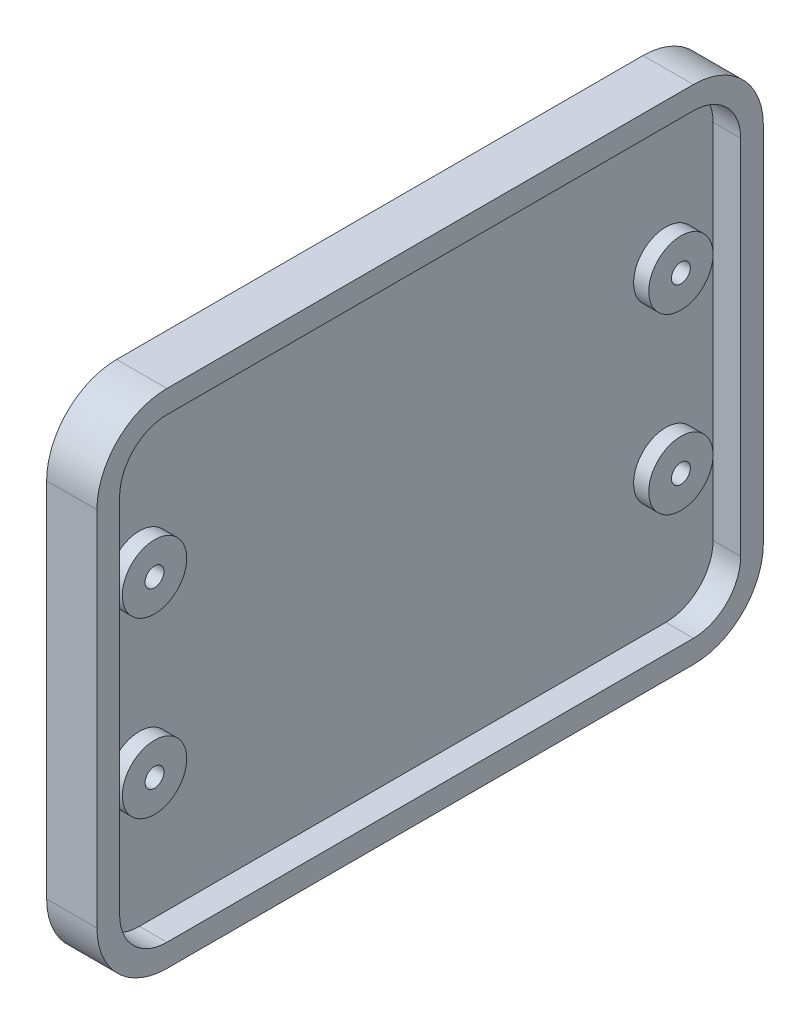
ISO-10303-21;
HEADER;
FILE_DESCRIPTION(('STEP AP214'),'2;1');
FILE_NAME('part.step','',(''),(''),'','','');
FILE_SCHEMA(('AUTOMOTIVE_DESIGN { 1 0 10303 214 1 1 1 1 }'));
ENDSEC;
DATA;
#1=APPLICATION_CONTEXT('core data for automotive mechanical design processes');
#2=APPLICATION_PROTOCOL_DEFINITION('international standard','automotive_design',2000,#1);
#3=PRODUCT_CONTEXT('',#1,'mechanical');
#4=PRODUCT('Part','Part','',(#3));
#5=PRODUCT_RELATED_PRODUCT_CATEGORY('part','',(#4));
#6=PRODUCT_DEFINITION_FORMATION('','',#4);
#7=PRODUCT_DEFINITION_CONTEXT('part definition',#1,'design');
#8=PRODUCT_DEFINITION('design','',#6,#7);
#9=PRODUCT_DEFINITION_SHAPE('','',#8);
#10=(LENGTH_UNIT() NAMED_UNIT(*) SI_UNIT(.MILLI.,.METRE.));
#11=(NAMED_UNIT(*) PLANE_ANGLE_UNIT() SI_UNIT($,.RADIAN.));
#12=(NAMED_UNIT(*) SI_UNIT($,.STERADIAN.) SOLID_ANGLE_UNIT());
#13=UNCERTAINTY_MEASURE_WITH_UNIT(LENGTH_MEASURE(1.E-05),#10,'distance_accuracy_value','');
#14=(GEOMETRIC_REPRESENTATION_CONTEXT(3) GLOBAL_UNCERTAINTY_ASSIGNED_CONTEXT((#13)) GLOBAL_UNIT_ASSIGNED_CONTEXT((#10,
#11,#12)) REPRESENTATION_CONTEXT('',''));
#15=CARTESIAN_POINT('',(0.,0.,0.));
#16=DIRECTION('',(0.,0.,1.));
#17=DIRECTION('',(1.,0.,0.));
#18=AXIS2_PLACEMENT_3D('',#15,#16,#17);
#19=CARTESIAN_POINT('',(0.,-6.,6.));
#20=DIRECTION('',(-1.,0.,0.));
#21=DIRECTION('',(0.,0.,1.));
#22=AXIS2_PLACEMENT_3D('',#19,#20,#21);
#23=PLANE('',#22);
#24=CARTESIAN_POINT('',(0.,-19.12,75.53));
#25=DIRECTION('',(-1.,0.,0.));
#26=DIRECTION('',(0.,0.,1.));
#27=AXIS2_PLACEMENT_3D('',#24,#25,#26);
#28=CIRCLE('',#27,4.25);
#29=CARTESIAN_POINT('',(0.,-19.12,79.78));
#30=VERTEX_POINT('',#29);
#31=EDGE_CURVE('E365',#30,#30,#28,.F.);
#32=ORIENTED_EDGE('',*,*,#31,.F.);
#33=EDGE_LOOP('',(#32));
#34=FACE_BOUND('',#33,.T.);
#35=CARTESIAN_POINT('',(0.,-19.12,6.));
#36=DIRECTION('',(-1.,0.,0.));
#37=DIRECTION('',(0.,0.,1.));
#38=AXIS2_PLACEMENT_3D('',#35,#36,#37);
#39=CIRCLE('',#38,4.25);
#40=CARTESIAN_POINT('',(0.,-19.12,10.25));
#41=VERTEX_POINT('',#40);
#42=EDGE_CURVE('E369',#41,#41,#39,.F.);
#43=ORIENTED_EDGE('',*,*,#42,.F.);
#44=EDGE_LOOP('',(#43));
#45=FACE_BOUND('',#44,.T.);
#46=CARTESIAN_POINT('',(0.,-42.05,6.));
#47=DIRECTION('',(-1.,0.,0.));
#48=DIRECTION('',(0.,0.,1.));
#49=AXIS2_PLACEMENT_3D('',#46,#47,#48);
#50=CIRCLE('',#49,4.25);
#51=CARTESIAN_POINT('',(0.,-42.05,10.25));
#52=VERTEX_POINT('',#51);
#53=EDGE_CURVE('E48',#52,#52,#50,.F.);
#54=ORIENTED_EDGE('',*,*,#53,.F.);
#55=EDGE_LOOP('',(#54));
#56=FACE_BOUND('',#55,.T.);
#57=CARTESIAN_POINT('',(0.,-42.05,75.53));
#58=DIRECTION('',(-1.,0.,0.));
#59=DIRECTION('',(0.,0.,1.));
#60=AXIS2_PLACEMENT_3D('',#57,#58,#59);
#61=CIRCLE('',#60,4.25);
#62=CARTESIAN_POINT('',(0.,-42.05,79.78));
#63=VERTEX_POINT('',#62);
#64=EDGE_CURVE('E11',#63,#63,#61,.F.);
#65=ORIENTED_EDGE('',*,*,#64,.F.);
#66=EDGE_LOOP('',(#65));
#67=FACE_BOUND('',#66,.T.);
#68=CARTESIAN_POINT('',(0.,-6.,6.));
#69=DIRECTION('',(1.,0.,0.));
#70=DIRECTION('',(0.,0.,-1.));
#71=AXIS2_PLACEMENT_3D('',#68,#69,#70);
#72=CIRCLE('',#71,6.25);
#73=CARTESIAN_POINT('',(0.,0.249999999999999,6.00000000000004));
#74=VERTEX_POINT('',#73);
#75=CARTESIAN_POINT('',(0.,-6.00000000000004,-0.25));
#76=VERTEX_POINT('',#75);
#77=EDGE_CURVE('E244',#74,#76,#72,.F.);
#78=ORIENTED_EDGE('',*,*,#77,.F.);
#79=DIRECTION('',(0.,0.,1.));
#80=VECTOR('',#79,1.);
#81=CARTESIAN_POINT('',(0.,0.249999999999999,0.));
#82=LINE('',#81,#80);
#83=CARTESIAN_POINT('',(0.,0.249999999999999,75.53));
#84=VERTEX_POINT('',#83);
#85=EDGE_CURVE('E240',#74,#84,#82,.T.);
#86=ORIENTED_EDGE('',*,*,#85,.T.);
#87=CARTESIAN_POINT('',(0.,-6.00000000000001,75.53));
#88=DIRECTION('',(1.,0.,0.));
#89=DIRECTION('',(0.,0.,-1.));
#90=AXIS2_PLACEMENT_3D('',#87,#88,#89);
#91=CIRCLE('',#90,6.25000000000001);
#92=CARTESIAN_POINT('',(0.,-6.00000000000001,81.78));
#93=VERTEX_POINT('',#92);
#94=EDGE_CURVE('E179',#84,#93,#91,.T.);
#95=ORIENTED_EDGE('',*,*,#94,.T.);
#96=DIRECTION('',(0.,-1.,0.));
#97=VECTOR('',#96,1.);
#98=CARTESIAN_POINT('',(0.,0.,81.78));
#99=LINE('',#98,#97);
#100=CARTESIAN_POINT('',(0.,-53.85,81.78));
#101=VERTEX_POINT('',#100);
#102=EDGE_CURVE('E55',#93,#101,#99,.T.);
#103=ORIENTED_EDGE('',*,*,#102,.T.);
#104=CARTESIAN_POINT('',(0.,-53.85,75.53));
#105=DIRECTION('',(1.,0.,0.));
#106=DIRECTION('',(0.,0.,-1.));
#107=AXIS2_PLACEMENT_3D('',#104,#105,#106);
#108=CIRCLE('',#107,6.25000000000001);
#109=CARTESIAN_POINT('',(0.,-60.1,75.5299999999999));
#110=VERTEX_POINT('',#109);
#111=EDGE_CURVE('E260',#110,#101,#108,.F.);
#112=ORIENTED_EDGE('',*,*,#111,.F.);
#113=DIRECTION('',(0.,0.,1.));
#114=VECTOR('',#113,1.);
#115=CARTESIAN_POINT('',(0.,-60.1,0.));
#116=LINE('',#115,#114);
#117=CARTESIAN_POINT('',(0.,-60.1,6.00000000000004));
#118=VERTEX_POINT('',#117);
#119=EDGE_CURVE('E256',#118,#110,#116,.T.);
#120=ORIENTED_EDGE('',*,*,#119,.F.);
#121=CARTESIAN_POINT('',(0.,-53.85,6.));
#122=DIRECTION('',(1.,0.,0.));
#123=DIRECTION('',(0.,0.,-1.));
#124=AXIS2_PLACEMENT_3D('',#121,#122,#123);
#125=CIRCLE('',#124,6.25);
#126=CARTESIAN_POINT('',(0.,-53.85,-0.249999999999999));
#127=VERTEX_POINT('',#126);
#128=EDGE_CURVE('E252',#127,#118,#125,.F.);
#129=ORIENTED_EDGE('',*,*,#128,.F.);
#130=DIRECTION('',(0.,-1.,0.));
#131=VECTOR('',#130,1.);
#132=CARTESIAN_POINT('',(0.,0.,-0.25));
#133=LINE('',#132,#131);
#134=EDGE_CURVE('E248',#76,#127,#133,.T.);
#135=ORIENTED_EDGE('',*,*,#134,.F.);
#136=EDGE_LOOP('',(#78,#86,#95,#103,#112,#120,#129,#135));
#137=FACE_BOUND('',#136,.T.);
#138=ADVANCED_FACE('F39',(#34,#45,#56,#67,#137),#23,.F.);
#139=CARTESIAN_POINT('',(2.,-19.12,75.53));
#140=DIRECTION('',(-1.,0.,0.));
#141=DIRECTION('',(0.,0.,1.));
#142=AXIS2_PLACEMENT_3D('',#139,#140,#141);
#143=CYLINDRICAL_SURFACE('',#142,1.25);
#144=CARTESIAN_POINT('',(2.,-19.12,75.53));
#145=DIRECTION('',(1.,0.,0.));
#146=DIRECTION('',(0.,0.,-1.));
#147=AXIS2_PLACEMENT_3D('',#144,#145,#146);
#148=CIRCLE('',#147,1.25);
#149=CARTESIAN_POINT('',(2.,-19.12,74.28));
#150=VERTEX_POINT('',#149);
#151=EDGE_CURVE('E313',#150,#150,#148,.T.);
#152=ORIENTED_EDGE('',*,*,#151,.T.);
#153=EDGE_LOOP('',(#152));
#154=FACE_BOUND('',#153,.T.);
#155=CARTESIAN_POINT('',(-3.,-19.12,75.53));
#156=DIRECTION('',(-1.,0.,0.));
#157=DIRECTION('',(0.,0.,1.));
#158=AXIS2_PLACEMENT_3D('',#155,#156,#157);
#159=CIRCLE('',#158,1.25);
#160=CARTESIAN_POINT('',(-3.,-19.12,76.78));
#161=VERTEX_POINT('',#160);
#162=EDGE_CURVE('E185',#161,#161,#159,.F.);
#163=ORIENTED_EDGE('',*,*,#162,.F.);
#164=EDGE_LOOP('',(#163));
#165=FACE_BOUND('',#164,.T.);
#166=ADVANCED_FACE('F380',(#154,#165),#143,.F.);
#167=CARTESIAN_POINT('',(2.,-19.12,75.53));
#168=DIRECTION('',(-1.,0.,0.));
#169=DIRECTION('',(0.,0.,1.));
#170=AXIS2_PLACEMENT_3D('',#167,#168,#169);
#171=CYLINDRICAL_SURFACE('',#170,4.25);
#172=CARTESIAN_POINT('',(2.,-19.12,75.53));
#173=DIRECTION('',(1.,0.,0.));
#174=DIRECTION('',(0.,0.,-1.));
#175=AXIS2_PLACEMENT_3D('',#172,#173,#174);
#176=CIRCLE('',#175,4.25);
#177=CARTESIAN_POINT('',(2.,-19.12,71.28));
#178=VERTEX_POINT('',#177);
#179=EDGE_CURVE('E317',#178,#178,#176,.T.);
#180=ORIENTED_EDGE('',*,*,#179,.F.);
#181=EDGE_LOOP('',(#180));
#182=FACE_BOUND('',#181,.T.);
#183=ORIENTED_EDGE('',*,*,#31,.T.);
#184=EDGE_LOOP('',(#183));
#185=FACE_BOUND('',#184,.T.);
#186=ADVANCED_FACE('F474',(#182,#185),#171,.T.);
#187=CARTESIAN_POINT('',(2.,0.,0.));
#188=DIRECTION('',(1.,0.,0.));
#189=DIRECTION('',(0.,0.,-1.));
#190=AXIS2_PLACEMENT_3D('',#187,#188,#189);
#191=PLANE('',#190);
#192=ORIENTED_EDGE('',*,*,#151,.F.);
#193=EDGE_LOOP('',(#192));
#194=FACE_BOUND('',#193,.T.);
#195=ORIENTED_EDGE('',*,*,#179,.T.);
#196=EDGE_LOOP('',(#195));
#197=FACE_BOUND('',#196,.T.);
#198=ADVANCED_FACE('F470',(#194,#197),#191,.T.);
#199=CARTESIAN_POINT('',(2.,-19.12,6.));
#200=DIRECTION('',(-1.,0.,0.));
#201=DIRECTION('',(0.,0.,1.));
#202=AXIS2_PLACEMENT_3D('',#199,#200,#201);
#203=CYLINDRICAL_SURFACE('',#202,1.25);
#204=CARTESIAN_POINT('',(2.,-19.12,6.));
#205=DIRECTION('',(1.,0.,0.));
#206=DIRECTION('',(0.,0.,-1.));
#207=AXIS2_PLACEMENT_3D('',#204,#205,#206);
#208=CIRCLE('',#207,1.25);
#209=CARTESIAN_POINT('',(2.,-19.12,4.75));
#210=VERTEX_POINT('',#209);
#211=EDGE_CURVE('E305',#210,#210,#208,.T.);
#212=ORIENTED_EDGE('',*,*,#211,.T.);
#213=EDGE_LOOP('',(#212));
#214=FACE_BOUND('',#213,.T.);
#215=CARTESIAN_POINT('',(-3.,-19.12,6.));
#216=DIRECTION('',(-1.,0.,0.));
#217=DIRECTION('',(0.,0.,1.));
#218=AXIS2_PLACEMENT_3D('',#215,#216,#217);
#219=CIRCLE('',#218,1.25);
#220=CARTESIAN_POINT('',(-3.,-19.12,7.25));
#221=VERTEX_POINT('',#220);
#222=EDGE_CURVE('E756',#221,#221,#219,.F.);
#223=ORIENTED_EDGE('',*,*,#222,.F.);
#224=EDGE_LOOP('',(#223));
#225=FACE_BOUND('',#224,.T.);
#226=ADVANCED_FACE('F466',(#214,#225),#203,.F.);
#227=CARTESIAN_POINT('',(2.,-19.12,6.));
#228=DIRECTION('',(-1.,0.,0.));
#229=DIRECTION('',(0.,0.,1.));
#230=AXIS2_PLACEMENT_3D('',#227,#228,#229);
#231=CYLINDRICAL_SURFACE('',#230,4.25);
#232=CARTESIAN_POINT('',(2.,-19.12,6.));
#233=DIRECTION('',(1.,0.,0.));
#234=DIRECTION('',(0.,0.,-1.));
#235=AXIS2_PLACEMENT_3D('',#232,#233,#234);
#236=CIRCLE('',#235,4.25);
#237=CARTESIAN_POINT('',(2.,-19.12,1.75));
#238=VERTEX_POINT('',#237);
#239=EDGE_CURVE('E309',#238,#238,#236,.T.);
#240=ORIENTED_EDGE('',*,*,#239,.F.);
#241=EDGE_LOOP('',(#240));
#242=FACE_BOUND('',#241,.T.);
#243=ORIENTED_EDGE('',*,*,#42,.T.);
#244=EDGE_LOOP('',(#243));
#245=FACE_BOUND('',#244,.T.);
#246=ADVANCED_FACE('F462',(#242,#245),#231,.T.);
#247=CARTESIAN_POINT('',(2.,0.,0.));
#248=DIRECTION('',(1.,0.,0.));
#249=DIRECTION('',(0.,0.,-1.));
#250=AXIS2_PLACEMENT_3D('',#247,#248,#249);
#251=PLANE('',#250);
#252=ORIENTED_EDGE('',*,*,#211,.F.);
#253=EDGE_LOOP('',(#252));
#254=FACE_BOUND('',#253,.T.);
#255=ORIENTED_EDGE('',*,*,#239,.T.);
#256=EDGE_LOOP('',(#255));
#257=FACE_BOUND('',#256,.T.);
#258=ADVANCED_FACE('F458',(#254,#257),#251,.T.);
#259=CARTESIAN_POINT('',(2.,-42.05,6.));
#260=DIRECTION('',(-1.,0.,0.));
#261=DIRECTION('',(0.,0.,1.));
#262=AXIS2_PLACEMENT_3D('',#259,#260,#261);
#263=CYLINDRICAL_SURFACE('',#262,1.25);
#264=CARTESIAN_POINT('',(2.,-42.05,6.));
#265=DIRECTION('',(1.,0.,0.));
#266=DIRECTION('',(0.,0.,-1.));
#267=AXIS2_PLACEMENT_3D('',#264,#265,#266);
#268=CIRCLE('',#267,1.25);
#269=CARTESIAN_POINT('',(2.,-42.05,4.75));
#270=VERTEX_POINT('',#269);
#271=EDGE_CURVE('E297',#270,#270,#268,.T.);
#272=ORIENTED_EDGE('',*,*,#271,.T.);
#273=EDGE_LOOP('',(#272));
#274=FACE_BOUND('',#273,.T.);
#275=CARTESIAN_POINT('',(-3.,-42.05,6.));
#276=DIRECTION('',(-1.,0.,0.));
#277=DIRECTION('',(0.,0.,1.));
#278=AXIS2_PLACEMENT_3D('',#275,#276,#277);
#279=CIRCLE('',#278,1.25);
#280=CARTESIAN_POINT('',(-3.,-42.05,7.25));
#281=VERTEX_POINT('',#280);
#282=EDGE_CURVE('E752',#281,#281,#279,.F.);
#283=ORIENTED_EDGE('',*,*,#282,.F.);
#284=EDGE_LOOP('',(#283));
#285=FACE_BOUND('',#284,.T.);
#286=ADVANCED_FACE('F454',(#274,#285),#263,.F.);
#287=CARTESIAN_POINT('',(2.,-42.05,6.));
#288=DIRECTION('',(-1.,0.,0.));
#289=DIRECTION('',(0.,0.,1.));
#290=AXIS2_PLACEMENT_3D('',#287,#288,#289);
#291=CYLINDRICAL_SURFACE('',#290,4.25);
#292=CARTESIAN_POINT('',(2.,-42.05,6.));
#293=DIRECTION('',(1.,0.,0.));
#294=DIRECTION('',(0.,0.,-1.));
#295=AXIS2_PLACEMENT_3D('',#292,#293,#294);
#296=CIRCLE('',#295,4.25);
#297=CARTESIAN_POINT('',(2.,-42.05,1.75));
#298=VERTEX_POINT('',#297);
#299=EDGE_CURVE('E301',#298,#298,#296,.T.);
#300=ORIENTED_EDGE('',*,*,#299,.F.);
#301=EDGE_LOOP('',(#300));
#302=FACE_BOUND('',#301,.T.);
#303=ORIENTED_EDGE('',*,*,#53,.T.);
#304=EDGE_LOOP('',(#303));
#305=FACE_BOUND('',#304,.T.);
#306=ADVANCED_FACE('F376',(#302,#305),#291,.T.);
#307=CARTESIAN_POINT('',(2.,0.,0.));
#308=DIRECTION('',(1.,0.,0.));
#309=DIRECTION('',(0.,0.,-1.));
#310=AXIS2_PLACEMENT_3D('',#307,#308,#309);
#311=PLANE('',#310);
#312=ORIENTED_EDGE('',*,*,#271,.F.);
#313=EDGE_LOOP('',(#312));
#314=FACE_BOUND('',#313,.T.);
#315=ORIENTED_EDGE('',*,*,#299,.T.);
#316=EDGE_LOOP('',(#315));
#317=FACE_BOUND('',#316,.T.);
#318=ADVANCED_FACE('F447',(#314,#317),#311,.T.);
#319=CARTESIAN_POINT('',(2.,-42.05,75.53));
#320=DIRECTION('',(-1.,0.,0.));
#321=DIRECTION('',(0.,0.,1.));
#322=AXIS2_PLACEMENT_3D('',#319,#320,#321);
#323=CYLINDRICAL_SURFACE('',#322,1.25);
#324=CARTESIAN_POINT('',(2.,-42.05,75.53));
#325=DIRECTION('',(1.,0.,0.));
#326=DIRECTION('',(0.,0.,-1.));
#327=AXIS2_PLACEMENT_3D('',#324,#325,#326);
#328=CIRCLE('',#327,1.25);
#329=CARTESIAN_POINT('',(2.,-42.05,74.28));
#330=VERTEX_POINT('',#329);
#331=EDGE_CURVE('E289',#330,#330,#328,.T.);
#332=ORIENTED_EDGE('',*,*,#331,.T.);
#333=EDGE_LOOP('',(#332));
#334=FACE_BOUND('',#333,.T.);
#335=CARTESIAN_POINT('',(-3.,-42.05,75.53));
#336=DIRECTION('',(-1.,0.,0.));
#337=DIRECTION('',(0.,0.,1.));
#338=AXIS2_PLACEMENT_3D('',#335,#336,#337);
#339=CIRCLE('',#338,1.25);
#340=CARTESIAN_POINT('',(-3.,-42.05,76.78));
#341=VERTEX_POINT('',#340);
#342=EDGE_CURVE('E748',#341,#341,#339,.F.);
#343=ORIENTED_EDGE('',*,*,#342,.F.);
#344=EDGE_LOOP('',(#343));
#345=FACE_BOUND('',#344,.T.);
#346=ADVANCED_FACE('F443',(#334,#345),#323,.F.);
#347=CARTESIAN_POINT('',(2.,-42.05,75.53));
#348=DIRECTION('',(-1.,0.,0.));
#349=DIRECTION('',(0.,0.,1.));
#350=AXIS2_PLACEMENT_3D('',#347,#348,#349);
#351=CYLINDRICAL_SURFACE('',#350,4.25);
#352=CARTESIAN_POINT('',(2.,-42.05,75.53));
#353=DIRECTION('',(1.,0.,0.));
#354=DIRECTION('',(0.,0.,-1.));
#355=AXIS2_PLACEMENT_3D('',#352,#353,#354);
#356=CIRCLE('',#355,4.25);
#357=CARTESIAN_POINT('',(2.,-42.05,71.28));
#358=VERTEX_POINT('',#357);
#359=EDGE_CURVE('E293',#358,#358,#356,.T.);
#360=ORIENTED_EDGE('',*,*,#359,.F.);
#361=EDGE_LOOP('',(#360));
#362=FACE_BOUND('',#361,.T.);
#363=ORIENTED_EDGE('',*,*,#64,.T.);
#364=EDGE_LOOP('',(#363));
#365=FACE_BOUND('',#364,.T.);
#366=ADVANCED_FACE('F439',(#362,#365),#351,.T.);
#367=CARTESIAN_POINT('',(2.,0.,0.));
#368=DIRECTION('',(1.,0.,0.));
#369=DIRECTION('',(0.,0.,-1.));
#370=AXIS2_PLACEMENT_3D('',#367,#368,#369);
#371=PLANE('',#370);
#372=ORIENTED_EDGE('',*,*,#331,.F.);
#373=EDGE_LOOP('',(#372));
#374=FACE_BOUND('',#373,.T.);
#375=ORIENTED_EDGE('',*,*,#359,.T.);
#376=EDGE_LOOP('',(#375));
#377=FACE_BOUND('',#376,.T.);
#378=ADVANCED_FACE('F436',(#374,#377),#371,.T.);
#379=CARTESIAN_POINT('',(3.64,0.249999999999999,0.));
#380=DIRECTION('',(0.,-1.,0.));
#381=DIRECTION('',(0.,0.,-1.));
#382=AXIS2_PLACEMENT_3D('',#379,#380,#381);
#383=PLANE('',#382);
#384=ORIENTED_EDGE('',*,*,#85,.F.);
#385=DIRECTION('',(-1.,0.,0.));
#386=VECTOR('',#385,1.);
#387=CARTESIAN_POINT('',(3.64,0.249999999999999,6.00000000000004));
#388=LINE('',#387,#386);
#389=CARTESIAN_POINT('',(3.64,0.249999999999999,6.00000000000004));
#390=VERTEX_POINT('',#389);
#391=EDGE_CURVE('E286',#390,#74,#388,.T.);
#392=ORIENTED_EDGE('',*,*,#391,.F.);
#393=DIRECTION('',(0.,0.,1.));
#394=VECTOR('',#393,1.);
#395=CARTESIAN_POINT('',(3.64,0.249999999999999,0.));
#396=LINE('',#395,#394);
#397=CARTESIAN_POINT('',(3.64,0.249999999999999,75.53));
#398=VERTEX_POINT('',#397);
#399=EDGE_CURVE('E208',#390,#398,#396,.T.);
#400=ORIENTED_EDGE('',*,*,#399,.T.);
#401=DIRECTION('',(-1.,0.,0.));
#402=VECTOR('',#401,1.);
#403=CARTESIAN_POINT('',(3.64,0.249999999999999,75.53));
#404=LINE('',#403,#402);
#405=EDGE_CURVE('E239',#398,#84,#404,.T.);
#406=ORIENTED_EDGE('',*,*,#405,.T.);
#407=EDGE_LOOP('',(#384,#392,#400,#406));
#408=FACE_BOUND('',#407,.T.);
#409=ADVANCED_FACE('F395',(#408),#383,.T.);
#410=CARTESIAN_POINT('',(3.64,-6.,6.));
#411=DIRECTION('',(-1.,0.,0.));
#412=DIRECTION('',(0.,0.,1.));
#413=AXIS2_PLACEMENT_3D('',#410,#411,#412);
#414=CYLINDRICAL_SURFACE('',#413,6.25);
#415=ORIENTED_EDGE('',*,*,#77,.T.);
#416=DIRECTION('',(-1.,0.,0.));
#417=VECTOR('',#416,1.);
#418=CARTESIAN_POINT('',(3.64,-6.00000000000004,-0.25));
#419=LINE('',#418,#417);
#420=CARTESIAN_POINT('',(3.64,-6.00000000000004,-0.25));
#421=VERTEX_POINT('',#420);
#422=EDGE_CURVE('E283',#421,#76,#419,.T.);
#423=ORIENTED_EDGE('',*,*,#422,.F.);
#424=CARTESIAN_POINT('',(3.64,-6.,6.));
#425=DIRECTION('',(1.,0.,0.));
#426=DIRECTION('',(0.,0.,-1.));
#427=AXIS2_PLACEMENT_3D('',#424,#425,#426);
#428=CIRCLE('',#427,6.25);
#429=EDGE_CURVE('E212',#390,#421,#428,.F.);
#430=ORIENTED_EDGE('',*,*,#429,.F.);
#431=ORIENTED_EDGE('',*,*,#391,.T.);
#432=EDGE_LOOP('',(#415,#423,#430,#431));
#433=FACE_BOUND('',#432,.T.);
#434=ADVANCED_FACE('F391',(#433),#414,.F.);
#435=CARTESIAN_POINT('',(3.64,0.,-0.25));
#436=DIRECTION('',(0.,0.,-1.));
#437=DIRECTION('',(0.,1.,0.));
#438=AXIS2_PLACEMENT_3D('',#435,#436,#437);
#439=PLANE('',#438);
#440=ORIENTED_EDGE('',*,*,#134,.T.);
#441=DIRECTION('',(-1.,0.,0.));
#442=VECTOR('',#441,1.);
#443=CARTESIAN_POINT('',(3.64,-53.85,-0.249999999999999));
#444=LINE('',#443,#442);
#445=CARTESIAN_POINT('',(3.64,-53.85,-0.249999999999999));
#446=VERTEX_POINT('',#445);
#447=EDGE_CURVE('E280',#446,#127,#444,.T.);
#448=ORIENTED_EDGE('',*,*,#447,.F.);
#449=DIRECTION('',(0.,-1.,0.));
#450=VECTOR('',#449,1.);
#451=CARTESIAN_POINT('',(3.64,0.,-0.25));
#452=LINE('',#451,#450);
#453=EDGE_CURVE('E216',#421,#446,#452,.T.);
#454=ORIENTED_EDGE('',*,*,#453,.F.);
#455=ORIENTED_EDGE('',*,*,#422,.T.);
#456=EDGE_LOOP('',(#440,#448,#454,#455));
#457=FACE_BOUND('',#456,.T.);
#458=ADVANCED_FACE('F413',(#457),#439,.F.);
#459=CARTESIAN_POINT('',(3.64,-53.85,6.));
#460=DIRECTION('',(-1.,0.,0.));
#461=DIRECTION('',(0.,0.,1.));
#462=AXIS2_PLACEMENT_3D('',#459,#460,#461);
#463=CYLINDRICAL_SURFACE('',#462,6.25);
#464=ORIENTED_EDGE('',*,*,#128,.T.);
#465=DIRECTION('',(-1.,0.,0.));
#466=VECTOR('',#465,1.);
#467=CARTESIAN_POINT('',(3.64,-60.1,6.00000000000004));
#468=LINE('',#467,#466);
#469=CARTESIAN_POINT('',(3.64,-60.1,6.00000000000004));
#470=VERTEX_POINT('',#469);
#471=EDGE_CURVE('E277',#470,#118,#468,.T.);
#472=ORIENTED_EDGE('',*,*,#471,.F.);
#473=CARTESIAN_POINT('',(3.64,-53.85,6.));
#474=DIRECTION('',(1.,0.,0.));
#475=DIRECTION('',(0.,0.,-1.));
#476=AXIS2_PLACEMENT_3D('',#473,#474,#475);
#477=CIRCLE('',#476,6.25);
#478=EDGE_CURVE('E220',#446,#470,#477,.F.);
#479=ORIENTED_EDGE('',*,*,#478,.F.);
#480=ORIENTED_EDGE('',*,*,#447,.T.);
#481=EDGE_LOOP('',(#464,#472,#479,#480));
#482=FACE_BOUND('',#481,.T.);
#483=ADVANCED_FACE('F410',(#482),#463,.F.);
#484=CARTESIAN_POINT('',(3.64,-60.1,0.));
#485=DIRECTION('',(0.,-1.,0.));
#486=DIRECTION('',(0.,0.,-1.));
#487=AXIS2_PLACEMENT_3D('',#484,#485,#486);
#488=PLANE('',#487);
#489=ORIENTED_EDGE('',*,*,#119,.T.);
#490=DIRECTION('',(-1.,0.,0.));
#491=VECTOR('',#490,1.);
#492=CARTESIAN_POINT('',(3.64,-60.1,75.5299999999999));
#493=LINE('',#492,#491);
#494=CARTESIAN_POINT('',(3.64,-60.1,75.5299999999999));
#495=VERTEX_POINT('',#494);
#496=EDGE_CURVE('E274',#495,#110,#493,.T.);
#497=ORIENTED_EDGE('',*,*,#496,.F.);
#498=DIRECTION('',(0.,0.,1.));
#499=VECTOR('',#498,1.);
#500=CARTESIAN_POINT('',(3.64,-60.1,0.));
#501=LINE('',#500,#499);
#502=EDGE_CURVE('E224',#470,#495,#501,.T.);
#503=ORIENTED_EDGE('',*,*,#502,.F.);
#504=ORIENTED_EDGE('',*,*,#471,.T.);
#505=EDGE_LOOP('',(#489,#497,#503,#504));
#506=FACE_BOUND('',#505,.T.);
#507=ADVANCED_FACE('F407',(#506),#488,.F.);
#508=CARTESIAN_POINT('',(3.64,-53.85,75.53));
#509=DIRECTION('',(-1.,0.,0.));
#510=DIRECTION('',(0.,0.,1.));
#511=AXIS2_PLACEMENT_3D('',#508,#509,#510);
#512=CYLINDRICAL_SURFACE('',#511,6.25000000000001);
#513=ORIENTED_EDGE('',*,*,#111,.T.);
#514=DIRECTION('',(-1.,0.,0.));
#515=VECTOR('',#514,1.);
#516=CARTESIAN_POINT('',(3.64,-53.85,81.78));
#517=LINE('',#516,#515);
#518=CARTESIAN_POINT('',(3.64,-53.85,81.78));
#519=VERTEX_POINT('',#518);
#520=EDGE_CURVE('E271',#519,#101,#517,.T.);
#521=ORIENTED_EDGE('',*,*,#520,.F.);
#522=CARTESIAN_POINT('',(3.64,-53.85,75.53));
#523=DIRECTION('',(1.,0.,0.));
#524=DIRECTION('',(0.,0.,-1.));
#525=AXIS2_PLACEMENT_3D('',#522,#523,#524);
#526=CIRCLE('',#525,6.25000000000001);
#527=EDGE_CURVE('E228',#495,#519,#526,.F.);
#528=ORIENTED_EDGE('',*,*,#527,.F.);
#529=ORIENTED_EDGE('',*,*,#496,.T.);
#530=EDGE_LOOP('',(#513,#521,#528,#529));
#531=FACE_BOUND('',#530,.T.);
#532=ADVANCED_FACE('F404',(#531),#512,.F.);
#533=CARTESIAN_POINT('',(3.64,0.,81.78));
#534=DIRECTION('',(0.,0.,-1.));
#535=DIRECTION('',(-1.,0.,0.));
#536=AXIS2_PLACEMENT_3D('',#533,#534,#535);
#537=PLANE('',#536);
#538=ORIENTED_EDGE('',*,*,#102,.F.);
#539=DIRECTION('',(-1.,0.,0.));
#540=VECTOR('',#539,1.);
#541=CARTESIAN_POINT('',(3.64,-6.00000000000005,81.78));
#542=LINE('',#541,#540);
#543=CARTESIAN_POINT('',(3.64,-6.00000000000005,81.78));
#544=VERTEX_POINT('',#543);
#545=EDGE_CURVE('E268',#544,#93,#542,.T.);
#546=ORIENTED_EDGE('',*,*,#545,.F.);
#547=DIRECTION('',(0.,-1.,0.));
#548=VECTOR('',#547,1.);
#549=CARTESIAN_POINT('',(3.64,0.,81.78));
#550=LINE('',#549,#548);
#551=EDGE_CURVE('E231',#544,#519,#550,.T.);
#552=ORIENTED_EDGE('',*,*,#551,.T.);
#553=ORIENTED_EDGE('',*,*,#520,.T.);
#554=EDGE_LOOP('',(#538,#546,#552,#553));
#555=FACE_BOUND('',#554,.T.);
#556=ADVANCED_FACE('F415',(#555),#537,.T.);
#557=CARTESIAN_POINT('',(3.64,-6.00000000000001,75.53));
#558=DIRECTION('',(-1.,0.,0.));
#559=DIRECTION('',(0.,0.,1.));
#560=AXIS2_PLACEMENT_3D('',#557,#558,#559);
#561=CYLINDRICAL_SURFACE('',#560,6.25000000000001);
#562=ORIENTED_EDGE('',*,*,#94,.F.);
#563=ORIENTED_EDGE('',*,*,#405,.F.);
#564=CARTESIAN_POINT('',(3.64,-6.00000000000001,75.53));
#565=DIRECTION('',(1.,0.,0.));
#566=DIRECTION('',(0.,0.,-1.));
#567=AXIS2_PLACEMENT_3D('',#564,#565,#566);
#568=CIRCLE('',#567,6.25000000000001);
#569=EDGE_CURVE('E235',#398,#544,#568,.T.);
#570=ORIENTED_EDGE('',*,*,#569,.T.);
#571=ORIENTED_EDGE('',*,*,#545,.T.);
#572=EDGE_LOOP('',(#562,#563,#570,#571));
#573=FACE_BOUND('',#572,.T.);
#574=ADVANCED_FACE('F399',(#573),#561,.F.);
#575=CARTESIAN_POINT('',(3.64,0.,0.));
#576=DIRECTION('',(1.,0.,0.));
#577=DIRECTION('',(0.,0.,-1.));
#578=AXIS2_PLACEMENT_3D('',#575,#576,#577);
#579=PLANE('',#578);
#580=CARTESIAN_POINT('',(3.64,-6.,6.));
#581=DIRECTION('',(1.,0.,0.));
#582=DIRECTION('',(0.,0.,-1.));
#583=AXIS2_PLACEMENT_3D('',#580,#581,#582);
#584=CIRCLE('',#583,9.25);
#585=CARTESIAN_POINT('',(3.64,3.25,6.));
#586=VERTEX_POINT('',#585);
#587=CARTESIAN_POINT('',(3.64,-6.,-3.25));
#588=VERTEX_POINT('',#587);
#589=EDGE_CURVE('E155',#586,#588,#584,.F.);
#590=ORIENTED_EDGE('',*,*,#589,.F.);
#591=DIRECTION('',(0.,0.,1.));
#592=VECTOR('',#591,1.);
#593=CARTESIAN_POINT('',(3.64,3.25,0.));
#594=LINE('',#593,#592);
#595=CARTESIAN_POINT('',(3.64,3.24999999999999,75.53));
#596=VERTEX_POINT('',#595);
#597=EDGE_CURVE('E165',#586,#596,#594,.T.);
#598=ORIENTED_EDGE('',*,*,#597,.T.);
#599=CARTESIAN_POINT('',(3.64,-6.00000000000001,75.53));
#600=DIRECTION('',(1.,0.,0.));
#601=DIRECTION('',(0.,0.,-1.));
#602=AXIS2_PLACEMENT_3D('',#599,#600,#601);
#603=CIRCLE('',#602,9.25);
#604=CARTESIAN_POINT('',(3.64,-6.00000000000007,84.78));
#605=VERTEX_POINT('',#604);
#606=EDGE_CURVE('E171',#596,#605,#603,.T.);
#607=ORIENTED_EDGE('',*,*,#606,.T.);
#608=DIRECTION('',(0.,-1.,0.));
#609=VECTOR('',#608,1.);
#610=CARTESIAN_POINT('',(3.64,0.,84.78));
#611=LINE('',#610,#609);
#612=CARTESIAN_POINT('',(3.64,-53.85,84.78));
#613=VERTEX_POINT('',#612);
#614=EDGE_CURVE('E190',#605,#613,#611,.T.);
#615=ORIENTED_EDGE('',*,*,#614,.T.);
#616=CARTESIAN_POINT('',(3.64,-53.85,75.53));
#617=DIRECTION('',(1.,0.,0.));
#618=DIRECTION('',(0.,0.,-1.));
#619=AXIS2_PLACEMENT_3D('',#616,#617,#618);
#620=CIRCLE('',#619,9.25000000000001);
#621=CARTESIAN_POINT('',(3.64,-63.1,75.5299999999999));
#622=VERTEX_POINT('',#621);
#623=EDGE_CURVE('E194',#622,#613,#620,.F.);
#624=ORIENTED_EDGE('',*,*,#623,.F.);
#625=DIRECTION('',(0.,0.,1.));
#626=VECTOR('',#625,1.);
#627=CARTESIAN_POINT('',(3.64,-63.1,0.));
#628=LINE('',#627,#626);
#629=CARTESIAN_POINT('',(3.64,-63.1,5.99999999999999));
#630=VERTEX_POINT('',#629);
#631=EDGE_CURVE('E198',#630,#622,#628,.T.);
#632=ORIENTED_EDGE('',*,*,#631,.F.);
#633=CARTESIAN_POINT('',(3.64,-53.85,5.99999999999999));
#634=DIRECTION('',(1.,0.,0.));
#635=DIRECTION('',(0.,0.,-1.));
#636=AXIS2_PLACEMENT_3D('',#633,#634,#635);
#637=CIRCLE('',#636,9.25);
#638=CARTESIAN_POINT('',(3.64,-53.8499999999999,-3.25000000000001));
#639=VERTEX_POINT('',#638);
#640=EDGE_CURVE('E202',#639,#630,#637,.F.);
#641=ORIENTED_EDGE('',*,*,#640,.F.);
#642=DIRECTION('',(0.,-1.,0.));
#643=VECTOR('',#642,1.);
#644=CARTESIAN_POINT('',(3.64,0.,-3.25));
#645=LINE('',#644,#643);
#646=EDGE_CURVE('E177',#588,#639,#645,.T.);
#647=ORIENTED_EDGE('',*,*,#646,.F.);
#648=EDGE_LOOP('',(#590,#598,#607,#615,#624,#632,#641,#647));
#649=FACE_BOUND('',#648,.T.);
#650=ORIENTED_EDGE('',*,*,#399,.F.);
#651=ORIENTED_EDGE('',*,*,#429,.T.);
#652=ORIENTED_EDGE('',*,*,#453,.T.);
#653=ORIENTED_EDGE('',*,*,#478,.T.);
#654=ORIENTED_EDGE('',*,*,#502,.T.);
#655=ORIENTED_EDGE('',*,*,#527,.T.);
#656=ORIENTED_EDGE('',*,*,#551,.F.);
#657=ORIENTED_EDGE('',*,*,#569,.F.);
#658=EDGE_LOOP('',(#650,#651,#652,#653,#654,#655,#656,#657));
#659=FACE_BOUND('',#658,.T.);
#660=ADVANCED_FACE('F173',(#649,#659),#579,.T.);
#661=CARTESIAN_POINT('',(-3.,-6.,6.));
#662=DIRECTION('',(-1.,0.,0.));
#663=DIRECTION('',(0.,0.,1.));
#664=AXIS2_PLACEMENT_3D('',#661,#662,#663);
#665=PLANE('',#664);
#666=ORIENTED_EDGE('',*,*,#342,.T.);
#667=EDGE_LOOP('',(#666));
#668=FACE_BOUND('',#667,.T.);
#669=ORIENTED_EDGE('',*,*,#282,.T.);
#670=EDGE_LOOP('',(#669));
#671=FACE_BOUND('',#670,.T.);
#672=ORIENTED_EDGE('',*,*,#222,.T.);
#673=EDGE_LOOP('',(#672));
#674=FACE_BOUND('',#673,.T.);
#675=ORIENTED_EDGE('',*,*,#162,.T.);
#676=EDGE_LOOP('',(#675));
#677=FACE_BOUND('',#676,.T.);
#678=CARTESIAN_POINT('',(-3.,-6.,6.));
#679=DIRECTION('',(-1.,0.,0.));
#680=DIRECTION('',(0.,0.,1.));
#681=AXIS2_PLACEMENT_3D('',#678,#679,#680);
#682=CIRCLE('',#681,9.25);
#683=CARTESIAN_POINT('',(-3.,3.25,6.));
#684=VERTEX_POINT('',#683);
#685=CARTESIAN_POINT('',(-3.,-6.,-3.25));
#686=VERTEX_POINT('',#685);
#687=EDGE_CURVE('E158',#684,#686,#682,.T.);
#688=ORIENTED_EDGE('',*,*,#687,.T.);
#689=DIRECTION('',(0.,-1.,0.));
#690=VECTOR('',#689,1.);
#691=CARTESIAN_POINT('',(-3.,-6.,-3.25));
#692=LINE('',#691,#690);
#693=CARTESIAN_POINT('',(-3.,-53.8499999999999,-3.25000000000001));
#694=VERTEX_POINT('',#693);
#695=EDGE_CURVE('E323',#686,#694,#692,.T.);
#696=ORIENTED_EDGE('',*,*,#695,.T.);
#697=CARTESIAN_POINT('',(-3.,-53.85,5.99999999999999));
#698=DIRECTION('',(-1.,0.,0.));
#699=DIRECTION('',(0.,0.,1.));
#700=AXIS2_PLACEMENT_3D('',#697,#698,#699);
#701=CIRCLE('',#700,9.25);
#702=CARTESIAN_POINT('',(-3.,-63.1,5.99999999999999));
#703=VERTEX_POINT('',#702);
#704=EDGE_CURVE('E326',#694,#703,#701,.T.);
#705=ORIENTED_EDGE('',*,*,#704,.T.);
#706=DIRECTION('',(0.,0.,1.));
#707=VECTOR('',#706,1.);
#708=CARTESIAN_POINT('',(-3.,-63.1,5.99999999999999));
#709=LINE('',#708,#707);
#710=CARTESIAN_POINT('',(-3.,-63.1,75.5299999999999));
#711=VERTEX_POINT('',#710);
#712=EDGE_CURVE('E329',#703,#711,#709,.T.);
#713=ORIENTED_EDGE('',*,*,#712,.T.);
#714=CARTESIAN_POINT('',(-3.,-53.85,75.53));
#715=DIRECTION('',(-1.,0.,0.));
#716=DIRECTION('',(0.,0.,1.));
#717=AXIS2_PLACEMENT_3D('',#714,#715,#716);
#718=CIRCLE('',#717,9.25000000000001);
#719=CARTESIAN_POINT('',(-3.,-53.85,84.78));
#720=VERTEX_POINT('',#719);
#721=EDGE_CURVE('E332',#711,#720,#718,.T.);
#722=ORIENTED_EDGE('',*,*,#721,.T.);
#723=DIRECTION('',(0.,-1.,0.));
#724=VECTOR('',#723,1.);
#725=CARTESIAN_POINT('',(-3.,-6.00000000000007,84.78));
#726=LINE('',#725,#724);
#727=CARTESIAN_POINT('',(-3.,-6.00000000000007,84.78));
#728=VERTEX_POINT('',#727);
#729=EDGE_CURVE('E335',#728,#720,#726,.T.);
#730=ORIENTED_EDGE('',*,*,#729,.F.);
#731=CARTESIAN_POINT('',(-3.,-6.00000000000001,75.53));
#732=DIRECTION('',(1.,0.,0.));
#733=DIRECTION('',(0.,0.,-1.));
#734=AXIS2_PLACEMENT_3D('',#731,#732,#733);
#735=CIRCLE('',#734,9.25);
#736=CARTESIAN_POINT('',(-3.,3.24999999999999,75.53));
#737=VERTEX_POINT('',#736);
#738=EDGE_CURVE('E339',#737,#728,#735,.T.);
#739=ORIENTED_EDGE('',*,*,#738,.F.);
#740=DIRECTION('',(0.,0.,1.));
#741=VECTOR('',#740,1.);
#742=CARTESIAN_POINT('',(-3.,3.25,6.));
#743=LINE('',#742,#741);
#744=EDGE_CURVE('E162',#684,#737,#743,.T.);
#745=ORIENTED_EDGE('',*,*,#744,.F.);
#746=EDGE_LOOP('',(#688,#696,#705,#713,#722,#730,#739,#745));
#747=FACE_BOUND('',#746,.T.);
#748=ADVANCED_FACE('F482',(#668,#671,#674,#677,#747),#665,.T.);
#749=CARTESIAN_POINT('',(-3.,-6.,-3.25));
#750=DIRECTION('',(0.,0.,1.));
#751=DIRECTION('',(0.,-1.,0.));
#752=AXIS2_PLACEMENT_3D('',#749,#750,#751);
#753=PLANE('',#752);
#754=DIRECTION('',(1.,0.,0.));
#755=VECTOR('',#754,1.);
#756=CARTESIAN_POINT('',(-3.,-6.,-3.25));
#757=LINE('',#756,#755);
#758=EDGE_CURVE('E362',#686,#588,#757,.T.);
#759=ORIENTED_EDGE('',*,*,#758,.T.);
#760=ORIENTED_EDGE('',*,*,#646,.T.);
#761=DIRECTION('',(1.,0.,0.));
#762=VECTOR('',#761,1.);
#763=CARTESIAN_POINT('',(-3.,-53.8499999999999,-3.25000000000001));
#764=LINE('',#763,#762);
#765=EDGE_CURVE('E359',#694,#639,#764,.T.);
#766=ORIENTED_EDGE('',*,*,#765,.F.);
#767=ORIENTED_EDGE('',*,*,#695,.F.);
#768=EDGE_LOOP('',(#759,#760,#766,#767));
#769=FACE_BOUND('',#768,.T.);
#770=ADVANCED_FACE('F484',(#769),#753,.F.);
#771=CARTESIAN_POINT('',(-3.,-53.85,5.99999999999999));
#772=DIRECTION('',(1.,0.,0.));
#773=DIRECTION('',(0.,0.,-1.));
#774=AXIS2_PLACEMENT_3D('',#771,#772,#773);
#775=CYLINDRICAL_SURFACE('',#774,9.25);
#776=ORIENTED_EDGE('',*,*,#765,.T.);
#777=ORIENTED_EDGE('',*,*,#640,.T.);
#778=DIRECTION('',(1.,0.,0.));
#779=VECTOR('',#778,1.);
#780=CARTESIAN_POINT('',(-3.,-63.1,5.99999999999999));
#781=LINE('',#780,#779);
#782=EDGE_CURVE('E356',#703,#630,#781,.T.);
#783=ORIENTED_EDGE('',*,*,#782,.F.);
#784=ORIENTED_EDGE('',*,*,#704,.F.);
#785=EDGE_LOOP('',(#776,#777,#783,#784));
#786=FACE_BOUND('',#785,.T.);
#787=ADVANCED_FACE('F504',(#786),#775,.T.);
#788=CARTESIAN_POINT('',(-3.,-63.1,5.99999999999999));
#789=DIRECTION('',(0.,1.,0.));
#790=DIRECTION('',(0.,0.,1.));
#791=AXIS2_PLACEMENT_3D('',#788,#789,#790);
#792=PLANE('',#791);
#793=ORIENTED_EDGE('',*,*,#782,.T.);
#794=ORIENTED_EDGE('',*,*,#631,.T.);
#795=DIRECTION('',(1.,0.,0.));
#796=VECTOR('',#795,1.);
#797=CARTESIAN_POINT('',(-3.,-63.1,75.5299999999999));
#798=LINE('',#797,#796);
#799=EDGE_CURVE('E353',#711,#622,#798,.T.);
#800=ORIENTED_EDGE('',*,*,#799,.F.);
#801=ORIENTED_EDGE('',*,*,#712,.F.);
#802=EDGE_LOOP('',(#793,#794,#800,#801));
#803=FACE_BOUND('',#802,.T.);
#804=ADVANCED_FACE('F500',(#803),#792,.F.);
#805=CARTESIAN_POINT('',(-3.,-53.85,75.53));
#806=DIRECTION('',(1.,0.,0.));
#807=DIRECTION('',(0.,0.,-1.));
#808=AXIS2_PLACEMENT_3D('',#805,#806,#807);
#809=CYLINDRICAL_SURFACE('',#808,9.25000000000001);
#810=ORIENTED_EDGE('',*,*,#799,.T.);
#811=ORIENTED_EDGE('',*,*,#623,.T.);
#812=DIRECTION('',(1.,0.,0.));
#813=VECTOR('',#812,1.);
#814=CARTESIAN_POINT('',(-3.,-53.85,84.78));
#815=LINE('',#814,#813);
#816=EDGE_CURVE('E350',#720,#613,#815,.T.);
#817=ORIENTED_EDGE('',*,*,#816,.F.);
#818=ORIENTED_EDGE('',*,*,#721,.F.);
#819=EDGE_LOOP('',(#810,#811,#817,#818));
#820=FACE_BOUND('',#819,.T.);
#821=ADVANCED_FACE('F496',(#820),#809,.T.);
#822=CARTESIAN_POINT('',(-3.,-6.00000000000007,84.78));
#823=DIRECTION('',(0.,0.,1.));
#824=DIRECTION('',(0.,-1.,0.));
#825=AXIS2_PLACEMENT_3D('',#822,#823,#824);
#826=PLANE('',#825);
#827=ORIENTED_EDGE('',*,*,#816,.T.);
#828=ORIENTED_EDGE('',*,*,#614,.F.);
#829=DIRECTION('',(1.,0.,0.));
#830=VECTOR('',#829,1.);
#831=CARTESIAN_POINT('',(-3.,-6.00000000000007,84.78));
#832=LINE('',#831,#830);
#833=EDGE_CURVE('E347',#728,#605,#832,.T.);
#834=ORIENTED_EDGE('',*,*,#833,.F.);
#835=ORIENTED_EDGE('',*,*,#729,.T.);
#836=EDGE_LOOP('',(#827,#828,#834,#835));
#837=FACE_BOUND('',#836,.T.);
#838=ADVANCED_FACE('F492',(#837),#826,.T.);
#839=CARTESIAN_POINT('',(-3.,-6.00000000000001,75.53));
#840=DIRECTION('',(1.,0.,0.));
#841=DIRECTION('',(0.,0.,-1.));
#842=AXIS2_PLACEMENT_3D('',#839,#840,#841);
#843=CYLINDRICAL_SURFACE('',#842,9.25);
#844=ORIENTED_EDGE('',*,*,#833,.T.);
#845=ORIENTED_EDGE('',*,*,#606,.F.);
#846=DIRECTION('',(1.,0.,0.));
#847=VECTOR('',#846,1.);
#848=CARTESIAN_POINT('',(-3.,3.24999999999999,75.53));
#849=LINE('',#848,#847);
#850=EDGE_CURVE('E161',#737,#596,#849,.T.);
#851=ORIENTED_EDGE('',*,*,#850,.F.);
#852=ORIENTED_EDGE('',*,*,#738,.T.);
#853=EDGE_LOOP('',(#844,#845,#851,#852));
#854=FACE_BOUND('',#853,.T.);
#855=ADVANCED_FACE('F489',(#854),#843,.T.);
#856=CARTESIAN_POINT('',(-3.,3.25,6.));
#857=DIRECTION('',(0.,1.,0.));
#858=DIRECTION('',(0.,0.,1.));
#859=AXIS2_PLACEMENT_3D('',#856,#857,#858);
#860=PLANE('',#859);
#861=ORIENTED_EDGE('',*,*,#850,.T.);
#862=ORIENTED_EDGE('',*,*,#597,.F.);
#863=DIRECTION('',(1.,0.,0.));
#864=VECTOR('',#863,1.);
#865=CARTESIAN_POINT('',(-3.,3.25,6.));
#866=LINE('',#865,#864);
#867=EDGE_CURVE('E63',#684,#586,#866,.T.);
#868=ORIENTED_EDGE('',*,*,#867,.F.);
#869=ORIENTED_EDGE('',*,*,#744,.T.);
#870=EDGE_LOOP('',(#861,#862,#868,#869));
#871=FACE_BOUND('',#870,.T.);
#872=ADVANCED_FACE('F166',(#871),#860,.T.);
#873=CARTESIAN_POINT('',(-3.,-6.,6.));
#874=DIRECTION('',(1.,0.,0.));
#875=DIRECTION('',(0.,0.,-1.));
#876=AXIS2_PLACEMENT_3D('',#873,#874,#875);
#877=CYLINDRICAL_SURFACE('',#876,9.25);
#878=ORIENTED_EDGE('',*,*,#867,.T.);
#879=ORIENTED_EDGE('',*,*,#589,.T.);
#880=ORIENTED_EDGE('',*,*,#758,.F.);
#881=ORIENTED_EDGE('',*,*,#687,.F.);
#882=EDGE_LOOP('',(#878,#879,#880,#881));
#883=FACE_BOUND('',#882,.T.);
#884=ADVANCED_FACE('F41',(#883),#877,.T.);
#885=CLOSED_SHELL('',(#138,#166,#186,#198,#226,#246,#258,#286,#306,#318,#346,#366,#378,#409,
#434,#458,#483,#507,#532,#556,#574,#660,#748,#770,#787,#804,#821,#838,#855,#872,#884));
#886=MANIFOLD_SOLID_BREP('B2',#885);
#887=ADVANCED_BREP_SHAPE_REPRESENTATION('',(#18,#886),#14);
#888=SHAPE_DEFINITION_REPRESENTATION(#9,#887);
ENDSEC;
END-ISO-10303-21;
